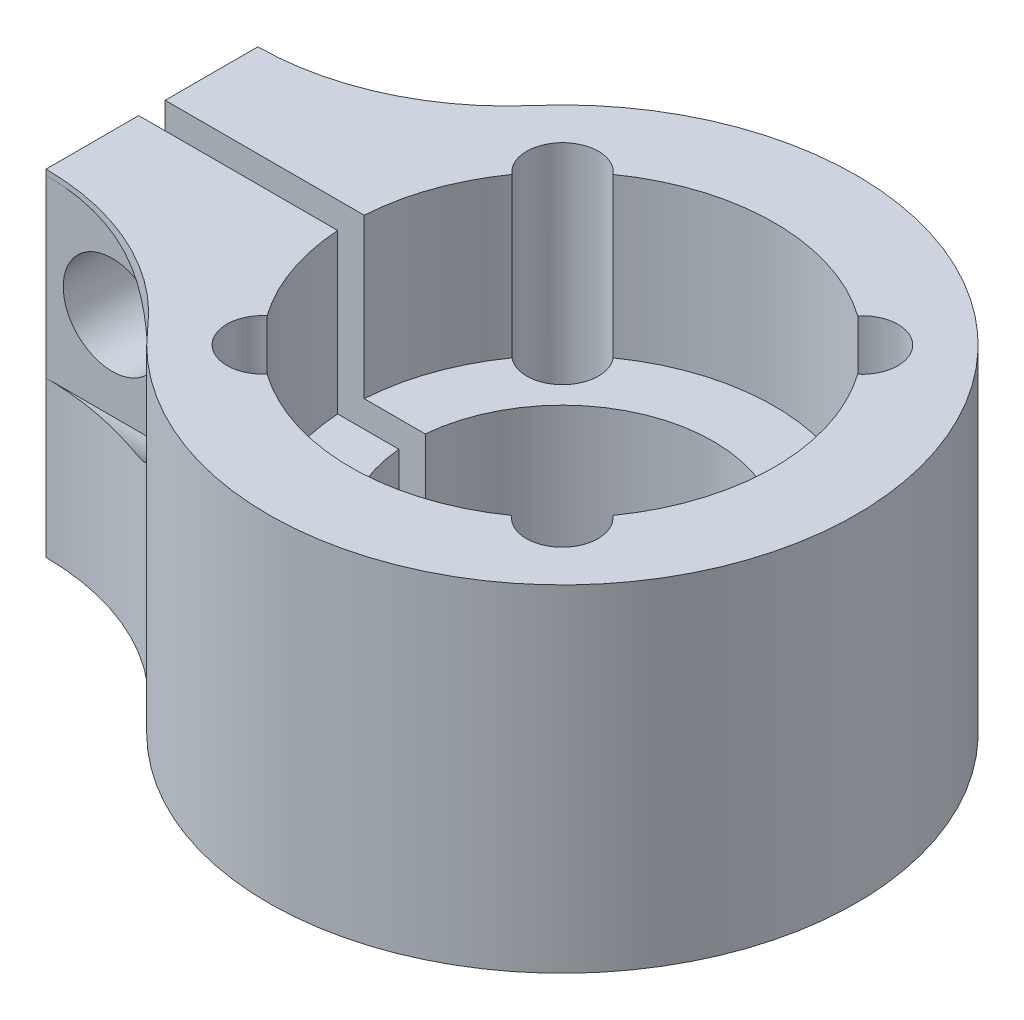
ISO-10303-21;
HEADER;
FILE_DESCRIPTION(('STEP AP214'),'2;1');
FILE_NAME('part.step','',(''),(''),'','','');
FILE_SCHEMA(('AUTOMOTIVE_DESIGN { 1 0 10303 214 1 1 1 1 }'));
ENDSEC;
DATA;
#1=APPLICATION_CONTEXT('core data for automotive mechanical design processes');
#2=APPLICATION_PROTOCOL_DEFINITION('international standard','automotive_design',2000,#1);
#3=PRODUCT_CONTEXT('',#1,'mechanical');
#4=PRODUCT('Part','Part','',(#3));
#5=PRODUCT_RELATED_PRODUCT_CATEGORY('part','',(#4));
#6=PRODUCT_DEFINITION_FORMATION('','',#4);
#7=PRODUCT_DEFINITION_CONTEXT('part definition',#1,'design');
#8=PRODUCT_DEFINITION('design','',#6,#7);
#9=PRODUCT_DEFINITION_SHAPE('','',#8);
#10=(LENGTH_UNIT() NAMED_UNIT(*) SI_UNIT(.MILLI.,.METRE.));
#11=(NAMED_UNIT(*) PLANE_ANGLE_UNIT() SI_UNIT($,.RADIAN.));
#12=(NAMED_UNIT(*) SI_UNIT($,.STERADIAN.) SOLID_ANGLE_UNIT());
#13=UNCERTAINTY_MEASURE_WITH_UNIT(LENGTH_MEASURE(1.E-05),#10,'distance_accuracy_value','');
#14=(GEOMETRIC_REPRESENTATION_CONTEXT(3) GLOBAL_UNCERTAINTY_ASSIGNED_CONTEXT((#13)) GLOBAL_UNIT_ASSIGNED_CONTEXT((#10,
#11,#12)) REPRESENTATION_CONTEXT('',''));
#15=CARTESIAN_POINT('',(0.,0.,0.));
#16=DIRECTION('',(0.,0.,1.));
#17=DIRECTION('',(1.,0.,0.));
#18=AXIS2_PLACEMENT_3D('',#15,#16,#17);
#19=CARTESIAN_POINT('',(0.,9.38839506172839,0.));
#20=DIRECTION('',(0.,1.,0.));
#21=DIRECTION('',(0.,0.,1.));
#22=AXIS2_PLACEMENT_3D('',#19,#20,#21);
#23=CYLINDRICAL_SURFACE('',#22,8.);
#24=CARTESIAN_POINT('',(0.,6.,0.));
#25=DIRECTION('',(0.,1.,0.));
#26=DIRECTION('',(0.,0.,1.));
#27=AXIS2_PLACEMENT_3D('',#24,#25,#26);
#28=CIRCLE('',#27,8.);
#29=CARTESIAN_POINT('',(-6.52782885157314,6.,-4.62465679640871));
#30=VERTEX_POINT('',#29);
#31=CARTESIAN_POINT('',(-7.98435971133566,6.,-0.499999999999998));
#32=VERTEX_POINT('',#31);
#33=EDGE_CURVE('E319',#30,#32,#28,.T.);
#34=ORIENTED_EDGE('',*,*,#33,.T.);
#35=DIRECTION('',(0.,1.,0.));
#36=VECTOR('',#35,1.);
#37=CARTESIAN_POINT('',(-7.98435971133566,9.38839506172839,-0.499999999999998));
#38=LINE('',#37,#36);
#39=CARTESIAN_POINT('',(-7.98435971133566,0.,-0.499999999999998));
#40=VERTEX_POINT('',#39);
#41=EDGE_CURVE('E231',#32,#40,#38,.F.);
#42=ORIENTED_EDGE('',*,*,#41,.T.);
#43=CARTESIAN_POINT('',(0.,0.,0.));
#44=DIRECTION('',(0.,1.,0.));
#45=DIRECTION('',(0.,0.,1.));
#46=AXIS2_PLACEMENT_3D('',#43,#44,#45);
#47=CIRCLE('',#46,8.);
#48=CARTESIAN_POINT('',(-6.52782885157314,0.,-4.62465679640872));
#49=VERTEX_POINT('',#48);
#50=EDGE_CURVE('E325',#49,#40,#47,.T.);
#51=ORIENTED_EDGE('',*,*,#50,.F.);
#52=DIRECTION('',(0.,1.,0.));
#53=VECTOR('',#52,1.);
#54=CARTESIAN_POINT('',(-6.52782885157314,-0.350000000000001,-4.62465679640871));
#55=LINE('',#54,#53);
#56=EDGE_CURVE('E260',#49,#30,#55,.T.);
#57=ORIENTED_EDGE('',*,*,#56,.T.);
#58=EDGE_LOOP('',(#34,#42,#51,#57));
#59=FACE_BOUND('',#58,.T.);
#60=ADVANCED_FACE('F33',(#59),#23,.F.);
#61=CARTESIAN_POINT('',(-15.5,-16.2120443701941,-4.));
#62=DIRECTION('',(-1.,0.,0.));
#63=DIRECTION('',(0.,0.,1.));
#64=AXIS2_PLACEMENT_3D('',#61,#62,#63);
#65=PLANE('',#64);
#66=DIRECTION('',(0.,1.,0.));
#67=VECTOR('',#66,1.);
#68=CARTESIAN_POINT('',(-15.5,-16.7498756211209,-0.499999999999998));
#69=LINE('',#68,#67);
#70=CARTESIAN_POINT('',(-15.5,-6.7,-0.499999999999998));
#71=VERTEX_POINT('',#70);
#72=CARTESIAN_POINT('',(-15.5,6.,-0.499999999999998));
#73=VERTEX_POINT('',#72);
#74=EDGE_CURVE('E209',#71,#73,#69,.T.);
#75=ORIENTED_EDGE('',*,*,#74,.T.);
#76=DIRECTION('',(0.,0.,1.));
#77=VECTOR('',#76,1.);
#78=CARTESIAN_POINT('',(-15.5,6.,-4.));
#79=LINE('',#78,#77);
#80=CARTESIAN_POINT('',(-15.5,6.,-4.));
#81=VERTEX_POINT('',#80);
#82=EDGE_CURVE('E240',#81,#73,#79,.T.);
#83=ORIENTED_EDGE('',*,*,#82,.F.);
#84=DIRECTION('',(0.,1.,0.));
#85=VECTOR('',#84,1.);
#86=CARTESIAN_POINT('',(-15.5,-16.2120443701941,-4.));
#87=LINE('',#86,#85);
#88=CARTESIAN_POINT('',(-15.5,-6.7,-4.));
#89=VERTEX_POINT('',#88);
#90=EDGE_CURVE('E244',#89,#81,#87,.T.);
#91=ORIENTED_EDGE('',*,*,#90,.F.);
#92=DIRECTION('',(0.,0.,-1.));
#93=VECTOR('',#92,1.);
#94=CARTESIAN_POINT('',(-15.5,-6.7,-4.));
#95=LINE('',#94,#93);
#96=EDGE_CURVE('E239',#71,#89,#95,.T.);
#97=ORIENTED_EDGE('',*,*,#96,.F.);
#98=EDGE_LOOP('',(#75,#83,#91,#97));
#99=FACE_BOUND('',#98,.T.);
#100=ADVANCED_FACE('F367',(#99),#65,.T.);
#101=CARTESIAN_POINT('',(-7.98435971133566,0.,0.5));
#102=VERTEX_POINT('',#101);
#103=CARTESIAN_POINT('',(-6.53296974265389,0.,4.61739172494264));
#104=VERTEX_POINT('',#103);
#105=EDGE_CURVE('E326',#102,#104,#47,.T.);
#106=ORIENTED_EDGE('',*,*,#105,.F.);
#107=DIRECTION('',(0.,1.,0.));
#108=VECTOR('',#107,1.);
#109=CARTESIAN_POINT('',(-7.98435971133566,9.38839506172839,0.5));
#110=LINE('',#109,#108);
#111=CARTESIAN_POINT('',(-7.98435971133566,6.,0.5));
#112=VERTEX_POINT('',#111);
#113=EDGE_CURVE('E222',#102,#112,#110,.T.);
#114=ORIENTED_EDGE('',*,*,#113,.T.);
#115=CARTESIAN_POINT('',(-6.53296974265388,6.,4.61739172494265));
#116=VERTEX_POINT('',#115);
#117=EDGE_CURVE('E320',#112,#116,#28,.T.);
#118=ORIENTED_EDGE('',*,*,#117,.T.);
#119=DIRECTION('',(0.,1.,0.));
#120=VECTOR('',#119,1.);
#121=CARTESIAN_POINT('',(-6.53296974265388,-0.350000000000001,4.61739172494265));
#122=LINE('',#121,#120);
#123=EDGE_CURVE('E268',#116,#104,#122,.F.);
#124=ORIENTED_EDGE('',*,*,#123,.T.);
#125=EDGE_LOOP('',(#106,#114,#118,#124));
#126=FACE_BOUND('',#125,.T.);
#127=ADVANCED_FACE('F417',(#126),#23,.F.);
#128=CARTESIAN_POINT('',(-4.6246567964087,0.,6.52782885157315));
#129=VERTEX_POINT('',#128);
#130=CARTESIAN_POINT('',(4.61739172494267,0.,6.53296974265387));
#131=VERTEX_POINT('',#130);
#132=EDGE_CURVE('E434',#129,#131,#47,.T.);
#133=ORIENTED_EDGE('',*,*,#132,.F.);
#134=DIRECTION('',(0.,1.,0.));
#135=VECTOR('',#134,1.);
#136=CARTESIAN_POINT('',(-4.62465679640869,-0.350000000000001,6.52782885157316));
#137=LINE('',#136,#135);
#138=CARTESIAN_POINT('',(-4.62465679640869,6.,6.52782885157316));
#139=VERTEX_POINT('',#138);
#140=EDGE_CURVE('E274',#129,#139,#137,.T.);
#141=ORIENTED_EDGE('',*,*,#140,.T.);
#142=CARTESIAN_POINT('',(4.61739172494268,6.,6.53296974265386));
#143=VERTEX_POINT('',#142);
#144=EDGE_CURVE('E447',#139,#143,#28,.T.);
#145=ORIENTED_EDGE('',*,*,#144,.T.);
#146=DIRECTION('',(0.,1.,0.));
#147=VECTOR('',#146,1.);
#148=CARTESIAN_POINT('',(4.61739172494267,-0.350000000000001,6.53296974265387));
#149=LINE('',#148,#147);
#150=EDGE_CURVE('E282',#143,#131,#149,.F.);
#151=ORIENTED_EDGE('',*,*,#150,.T.);
#152=EDGE_LOOP('',(#133,#141,#145,#151));
#153=FACE_BOUND('',#152,.T.);
#154=ADVANCED_FACE('F424',(#153),#23,.F.);
#155=CARTESIAN_POINT('',(6.52782885157317,0.,4.62465679640867));
#156=VERTEX_POINT('',#155);
#157=CARTESIAN_POINT('',(6.53296974265385,0.,-4.61739172494269));
#158=VERTEX_POINT('',#157);
#159=EDGE_CURVE('E318',#156,#158,#47,.T.);
#160=ORIENTED_EDGE('',*,*,#159,.F.);
#161=DIRECTION('',(0.,1.,0.));
#162=VECTOR('',#161,1.);
#163=CARTESIAN_POINT('',(6.52782885157317,-0.350000000000001,4.62465679640867));
#164=LINE('',#163,#162);
#165=CARTESIAN_POINT('',(6.52782885157317,6.,4.62465679640867));
#166=VERTEX_POINT('',#165);
#167=EDGE_CURVE('E288',#156,#166,#164,.T.);
#168=ORIENTED_EDGE('',*,*,#167,.T.);
#169=CARTESIAN_POINT('',(6.53296974265385,6.,-4.6173917249427));
#170=VERTEX_POINT('',#169);
#171=EDGE_CURVE('E314',#166,#170,#28,.T.);
#172=ORIENTED_EDGE('',*,*,#171,.T.);
#173=DIRECTION('',(0.,1.,0.));
#174=VECTOR('',#173,1.);
#175=CARTESIAN_POINT('',(6.53296974265385,-0.350000000000001,-4.61739172494269));
#176=LINE('',#175,#174);
#177=EDGE_CURVE('E296',#170,#158,#176,.F.);
#178=ORIENTED_EDGE('',*,*,#177,.T.);
#179=EDGE_LOOP('',(#160,#168,#172,#178));
#180=FACE_BOUND('',#179,.T.);
#181=ADVANCED_FACE('F400',(#180),#23,.F.);
#182=CARTESIAN_POINT('',(0.,9.38839506172839,0.));
#183=DIRECTION('',(0.,1.,0.));
#184=DIRECTION('',(0.,0.,1.));
#185=AXIS2_PLACEMENT_3D('',#182,#183,#184);
#186=CYLINDRICAL_SURFACE('',#185,5.7);
#187=CARTESIAN_POINT('',(0.,0.,0.));
#188=DIRECTION('',(0.,1.,0.));
#189=DIRECTION('',(0.,0.,1.));
#190=AXIS2_PLACEMENT_3D('',#187,#188,#189);
#191=CIRCLE('',#190,5.7);
#192=CARTESIAN_POINT('',(-5.67802782663136,0.,0.499999999999999));
#193=VERTEX_POINT('',#192);
#194=CARTESIAN_POINT('',(-5.67802782663136,0.,-0.499999999999998));
#195=VERTEX_POINT('',#194);
#196=EDGE_CURVE('E324',#193,#195,#191,.T.);
#197=ORIENTED_EDGE('',*,*,#196,.T.);
#198=DIRECTION('',(0.,1.,0.));
#199=VECTOR('',#198,1.);
#200=CARTESIAN_POINT('',(-5.67802782663136,9.38839506172839,-0.499999999999998));
#201=LINE('',#200,#199);
#202=CARTESIAN_POINT('',(-5.67802782663136,-6.7,-0.499999999999998));
#203=VERTEX_POINT('',#202);
#204=EDGE_CURVE('E228',#195,#203,#201,.F.);
#205=ORIENTED_EDGE('',*,*,#204,.T.);
#206=CARTESIAN_POINT('',(0.,-6.7,0.));
#207=DIRECTION('',(0.,1.,0.));
#208=DIRECTION('',(0.,0.,1.));
#209=AXIS2_PLACEMENT_3D('',#206,#207,#208);
#210=CIRCLE('',#209,5.7);
#211=CARTESIAN_POINT('',(-5.67802782663136,-6.7,0.499999999999999));
#212=VERTEX_POINT('',#211);
#213=EDGE_CURVE('E305',#212,#203,#210,.T.);
#214=ORIENTED_EDGE('',*,*,#213,.F.);
#215=DIRECTION('',(0.,1.,0.));
#216=VECTOR('',#215,1.);
#217=CARTESIAN_POINT('',(-5.67802782663136,9.38839506172839,0.499999999999999));
#218=LINE('',#217,#216);
#219=EDGE_CURVE('E219',#212,#193,#218,.T.);
#220=ORIENTED_EDGE('',*,*,#219,.T.);
#221=EDGE_LOOP('',(#197,#205,#214,#220));
#222=FACE_BOUND('',#221,.T.);
#223=ADVANCED_FACE('F403',(#222),#186,.F.);
#224=CARTESIAN_POINT('',(5.7,0.,0.));
#225=DIRECTION('',(0.,-1.,0.));
#226=DIRECTION('',(0.,0.,-1.));
#227=AXIS2_PLACEMENT_3D('',#224,#225,#226);
#228=PLANE('',#227);
#229=ORIENTED_EDGE('',*,*,#50,.T.);
#230=DIRECTION('',(1.,0.,0.));
#231=VECTOR('',#230,1.);
#232=CARTESIAN_POINT('',(5.7,0.,-0.499999999999997));
#233=LINE('',#232,#231);
#234=EDGE_CURVE('E225',#40,#195,#233,.T.);
#235=ORIENTED_EDGE('',*,*,#234,.T.);
#236=ORIENTED_EDGE('',*,*,#196,.F.);
#237=DIRECTION('',(-1.,0.,0.));
#238=VECTOR('',#237,1.);
#239=CARTESIAN_POINT('',(5.7,0.,0.499999999999996));
#240=LINE('',#239,#238);
#241=EDGE_CURVE('E216',#193,#102,#240,.T.);
#242=ORIENTED_EDGE('',*,*,#241,.T.);
#243=ORIENTED_EDGE('',*,*,#105,.T.);
#244=CARTESIAN_POINT('',(-5.66000000000004,0.,5.65370674867379));
#245=DIRECTION('',(0.,-1.,0.));
#246=DIRECTION('',(0.,0.,-1.));
#247=AXIS2_PLACEMENT_3D('',#244,#245,#246);
#248=CIRCLE('',#247,1.355);
#249=EDGE_CURVE('E271',#104,#129,#248,.T.);
#250=ORIENTED_EDGE('',*,*,#249,.T.);
#251=ORIENTED_EDGE('',*,*,#132,.T.);
#252=CARTESIAN_POINT('',(5.65370674867381,0.,5.66000000000002));
#253=DIRECTION('',(0.,-1.,0.));
#254=DIRECTION('',(0.,0.,-1.));
#255=AXIS2_PLACEMENT_3D('',#252,#253,#254);
#256=CIRCLE('',#255,1.355);
#257=EDGE_CURVE('E285',#131,#156,#256,.T.);
#258=ORIENTED_EDGE('',*,*,#257,.T.);
#259=ORIENTED_EDGE('',*,*,#159,.T.);
#260=CARTESIAN_POINT('',(5.66,0.,-5.65370674867383));
#261=DIRECTION('',(0.,-1.,0.));
#262=DIRECTION('',(0.,0.,-1.));
#263=AXIS2_PLACEMENT_3D('',#260,#261,#262);
#264=CIRCLE('',#263,1.355);
#265=CARTESIAN_POINT('',(4.62465679640865,0.,-6.52782885157318));
#266=VERTEX_POINT('',#265);
#267=EDGE_CURVE('E299',#158,#266,#264,.T.);
#268=ORIENTED_EDGE('',*,*,#267,.T.);
#269=CARTESIAN_POINT('',(-4.61739172494262,0.,-6.5329697426539));
#270=VERTEX_POINT('',#269);
#271=EDGE_CURVE('E321',#266,#270,#47,.T.);
#272=ORIENTED_EDGE('',*,*,#271,.T.);
#273=CARTESIAN_POINT('',(-5.65370674867377,0.,-5.66000000000006));
#274=DIRECTION('',(0.,-1.,0.));
#275=DIRECTION('',(0.,0.,-1.));
#276=AXIS2_PLACEMENT_3D('',#273,#274,#275);
#277=CIRCLE('',#276,1.355);
#278=EDGE_CURVE('E257',#270,#49,#277,.T.);
#279=ORIENTED_EDGE('',*,*,#278,.T.);
#280=EDGE_LOOP('',(#229,#235,#236,#242,#243,#250,#251,#258,#259,#268,#272,#279));
#281=FACE_BOUND('',#280,.T.);
#282=ADVANCED_FACE('F398',(#281),#228,.F.);
#283=CARTESIAN_POINT('',(4.62465679640865,6.,-6.52782885157319));
#284=VERTEX_POINT('',#283);
#285=CARTESIAN_POINT('',(-4.61739172494263,6.,-6.5329697426539));
#286=VERTEX_POINT('',#285);
#287=EDGE_CURVE('E315',#284,#286,#28,.T.);
#288=ORIENTED_EDGE('',*,*,#287,.T.);
#289=DIRECTION('',(0.,1.,0.));
#290=VECTOR('',#289,1.);
#291=CARTESIAN_POINT('',(-4.61739172494263,-0.350000000000001,-6.5329697426539));
#292=LINE('',#291,#290);
#293=EDGE_CURVE('E254',#286,#270,#292,.F.);
#294=ORIENTED_EDGE('',*,*,#293,.T.);
#295=ORIENTED_EDGE('',*,*,#271,.F.);
#296=DIRECTION('',(0.,1.,0.));
#297=VECTOR('',#296,1.);
#298=CARTESIAN_POINT('',(4.62465679640865,-0.350000000000001,-6.52782885157319));
#299=LINE('',#298,#297);
#300=EDGE_CURVE('E302',#266,#284,#299,.T.);
#301=ORIENTED_EDGE('',*,*,#300,.T.);
#302=EDGE_LOOP('',(#288,#294,#295,#301));
#303=FACE_BOUND('',#302,.T.);
#304=ADVANCED_FACE('F394',(#303),#23,.F.);
#305=CARTESIAN_POINT('',(8.,6.,0.));
#306=DIRECTION('',(0.,-1.,0.));
#307=DIRECTION('',(0.,0.,-1.));
#308=AXIS2_PLACEMENT_3D('',#305,#306,#307);
#309=PLANE('',#308);
#310=ORIENTED_EDGE('',*,*,#82,.T.);
#311=DIRECTION('',(-1.,0.,0.));
#312=VECTOR('',#311,1.);
#313=CARTESIAN_POINT('',(-15.5,6.,-0.499999999999998));
#314=LINE('',#313,#312);
#315=EDGE_CURVE('E61',#32,#73,#314,.T.);
#316=ORIENTED_EDGE('',*,*,#315,.F.);
#317=ORIENTED_EDGE('',*,*,#33,.F.);
#318=CARTESIAN_POINT('',(-5.65370674867377,6.,-5.66000000000006));
#319=DIRECTION('',(0.,1.,0.));
#320=DIRECTION('',(1.,0.,0.));
#321=AXIS2_PLACEMENT_3D('',#318,#319,#320);
#322=CIRCLE('',#321,1.355);
#323=EDGE_CURVE('E238',#286,#30,#322,.T.);
#324=ORIENTED_EDGE('',*,*,#323,.F.);
#325=ORIENTED_EDGE('',*,*,#287,.F.);
#326=CARTESIAN_POINT('',(5.66,6.,-5.65370674867383));
#327=DIRECTION('',(0.,1.,0.));
#328=DIRECTION('',(0.,0.,1.));
#329=AXIS2_PLACEMENT_3D('',#326,#327,#328);
#330=CIRCLE('',#329,1.355);
#331=EDGE_CURVE('E291',#170,#284,#330,.T.);
#332=ORIENTED_EDGE('',*,*,#331,.F.);
#333=ORIENTED_EDGE('',*,*,#171,.F.);
#334=CARTESIAN_POINT('',(5.65370674867381,6.,5.66000000000002));
#335=DIRECTION('',(0.,1.,0.));
#336=DIRECTION('',(-1.,0.,0.));
#337=AXIS2_PLACEMENT_3D('',#334,#335,#336);
#338=CIRCLE('',#337,1.355);
#339=EDGE_CURVE('E277',#143,#166,#338,.T.);
#340=ORIENTED_EDGE('',*,*,#339,.F.);
#341=ORIENTED_EDGE('',*,*,#144,.F.);
#342=CARTESIAN_POINT('',(-5.66000000000004,6.,5.65370674867379));
#343=DIRECTION('',(0.,1.,0.));
#344=DIRECTION('',(0.,0.,-1.));
#345=AXIS2_PLACEMENT_3D('',#342,#343,#344);
#346=CIRCLE('',#345,1.355);
#347=EDGE_CURVE('E263',#116,#139,#346,.T.);
#348=ORIENTED_EDGE('',*,*,#347,.F.);
#349=ORIENTED_EDGE('',*,*,#117,.F.);
#350=DIRECTION('',(1.,0.,0.));
#351=VECTOR('',#350,1.);
#352=CARTESIAN_POINT('',(-15.5,6.,0.500000000000002));
#353=LINE('',#352,#351);
#354=CARTESIAN_POINT('',(-15.5,6.,0.500000000000002));
#355=VERTEX_POINT('',#354);
#356=EDGE_CURVE('E204',#355,#112,#353,.T.);
#357=ORIENTED_EDGE('',*,*,#356,.F.);
#358=CARTESIAN_POINT('',(-15.5,6.,4.));
#359=VERTEX_POINT('',#358);
#360=EDGE_CURVE('E234',#355,#359,#79,.T.);
#361=ORIENTED_EDGE('',*,*,#360,.T.);
#362=CARTESIAN_POINT('',(-15.5361985405909,6.,13.4479306552101));
#363=DIRECTION('',(0.,-1.,0.));
#364=DIRECTION('',(0.,0.,-1.));
#365=AXIS2_PLACEMENT_3D('',#362,#363,#364);
#366=CIRCLE('',#365,9.448);
#367=CARTESIAN_POINT('',(-8.39263207127503,6.,7.26455276780379));
#368=VERTEX_POINT('',#367);
#369=EDGE_CURVE('E338',#359,#368,#366,.T.);
#370=ORIENTED_EDGE('',*,*,#369,.T.);
#371=CARTESIAN_POINT('',(0.,6.,0.));
#372=DIRECTION('',(0.,1.,0.));
#373=DIRECTION('',(0.,0.,1.));
#374=AXIS2_PLACEMENT_3D('',#371,#372,#373);
#375=CIRCLE('',#374,11.1);
#376=CARTESIAN_POINT('',(-8.39263207127503,6.,-7.26455276780379));
#377=VERTEX_POINT('',#376);
#378=EDGE_CURVE('E311',#368,#377,#375,.T.);
#379=ORIENTED_EDGE('',*,*,#378,.T.);
#380=CARTESIAN_POINT('',(-15.5361985405909,6.,-13.4479306552101));
#381=DIRECTION('',(0.,-1.,0.));
#382=DIRECTION('',(0.,0.,-1.));
#383=AXIS2_PLACEMENT_3D('',#380,#381,#382);
#384=CIRCLE('',#383,9.448);
#385=EDGE_CURVE('E334',#377,#81,#384,.T.);
#386=ORIENTED_EDGE('',*,*,#385,.T.);
#387=EDGE_LOOP('',(#310,#316,#317,#324,#325,#332,#333,#340,#341,#348,#349,#357,#361,#370,#379,#386));
#388=FACE_BOUND('',#387,.T.);
#389=ADVANCED_FACE('F390',(#388),#309,.F.);
#390=CARTESIAN_POINT('',(0.,9.38839506172839,0.));
#391=DIRECTION('',(0.,1.,0.));
#392=DIRECTION('',(0.,0.,1.));
#393=AXIS2_PLACEMENT_3D('',#390,#391,#392);
#394=CYLINDRICAL_SURFACE('',#393,11.1);
#395=CARTESIAN_POINT('',(0.,-6.7,0.));
#396=DIRECTION('',(0.,1.,0.));
#397=DIRECTION('',(0.,0.,1.));
#398=AXIS2_PLACEMENT_3D('',#395,#396,#397);
#399=CIRCLE('',#398,11.1);
#400=CARTESIAN_POINT('',(-8.39263207127504,-6.7,7.26455276780379));
#401=VERTEX_POINT('',#400);
#402=CARTESIAN_POINT('',(-8.39263207127504,-6.7,-7.26455276780379));
#403=VERTEX_POINT('',#402);
#404=EDGE_CURVE('E308',#401,#403,#399,.T.);
#405=ORIENTED_EDGE('',*,*,#404,.T.);
#406=DIRECTION('',(0.,1.,0.));
#407=VECTOR('',#406,1.);
#408=CARTESIAN_POINT('',(-8.39263207127503,9.38839506172839,-7.26455276780379));
#409=LINE('',#408,#407);
#410=EDGE_CURVE('E331',#403,#377,#409,.T.);
#411=ORIENTED_EDGE('',*,*,#410,.T.);
#412=ORIENTED_EDGE('',*,*,#378,.F.);
#413=DIRECTION('',(0.,1.,0.));
#414=VECTOR('',#413,1.);
#415=CARTESIAN_POINT('',(-8.39263207127503,9.38839506172839,7.26455276780379));
#416=LINE('',#415,#414);
#417=EDGE_CURVE('E329',#368,#401,#416,.F.);
#418=ORIENTED_EDGE('',*,*,#417,.T.);
#419=EDGE_LOOP('',(#405,#411,#412,#418));
#420=FACE_BOUND('',#419,.T.);
#421=ADVANCED_FACE('F386',(#420),#394,.T.);
#422=CARTESIAN_POINT('',(11.1,-6.7,0.));
#423=DIRECTION('',(0.,1.,0.));
#424=DIRECTION('',(0.,0.,1.));
#425=AXIS2_PLACEMENT_3D('',#422,#423,#424);
#426=PLANE('',#425);
#427=CARTESIAN_POINT('',(-5.65370674867377,-6.7,-5.66000000000006));
#428=DIRECTION('',(0.,1.,0.));
#429=DIRECTION('',(0.,0.,1.));
#430=AXIS2_PLACEMENT_3D('',#427,#428,#429);
#431=CIRCLE('',#430,1.355);
#432=CARTESIAN_POINT('',(-5.65370674867377,-6.7,-4.30500000000006));
#433=VERTEX_POINT('',#432);
#434=EDGE_CURVE('E251',#433,#433,#431,.F.);
#435=ORIENTED_EDGE('',*,*,#434,.F.);
#436=EDGE_LOOP('',(#435));
#437=FACE_BOUND('',#436,.T.);
#438=CARTESIAN_POINT('',(-5.66000000000004,-6.7,5.65370674867379));
#439=DIRECTION('',(0.,1.,0.));
#440=DIRECTION('',(0.,0.,1.));
#441=AXIS2_PLACEMENT_3D('',#438,#439,#440);
#442=CIRCLE('',#441,1.355);
#443=CARTESIAN_POINT('',(-5.66000000000004,-6.7,7.00870674867379));
#444=VERTEX_POINT('',#443);
#445=EDGE_CURVE('E265',#444,#444,#442,.F.);
#446=ORIENTED_EDGE('',*,*,#445,.F.);
#447=EDGE_LOOP('',(#446));
#448=FACE_BOUND('',#447,.T.);
#449=CARTESIAN_POINT('',(5.65370674867381,-6.7,5.66000000000002));
#450=DIRECTION('',(0.,1.,0.));
#451=DIRECTION('',(0.,0.,1.));
#452=AXIS2_PLACEMENT_3D('',#449,#450,#451);
#453=CIRCLE('',#452,1.355);
#454=CARTESIAN_POINT('',(5.65370674867381,-6.7,7.01500000000002));
#455=VERTEX_POINT('',#454);
#456=EDGE_CURVE('E279',#455,#455,#453,.F.);
#457=ORIENTED_EDGE('',*,*,#456,.F.);
#458=EDGE_LOOP('',(#457));
#459=FACE_BOUND('',#458,.T.);
#460=CARTESIAN_POINT('',(5.66,-6.7,-5.65370674867383));
#461=DIRECTION('',(0.,1.,0.));
#462=DIRECTION('',(0.,0.,1.));
#463=AXIS2_PLACEMENT_3D('',#460,#461,#462);
#464=CIRCLE('',#463,1.355);
#465=CARTESIAN_POINT('',(5.66,-6.7,-4.29870674867383));
#466=VERTEX_POINT('',#465);
#467=EDGE_CURVE('E293',#466,#466,#464,.F.);
#468=ORIENTED_EDGE('',*,*,#467,.F.);
#469=EDGE_LOOP('',(#468));
#470=FACE_BOUND('',#469,.T.);
#471=ORIENTED_EDGE('',*,*,#213,.T.);
#472=DIRECTION('',(1.,0.,0.));
#473=VECTOR('',#472,1.);
#474=CARTESIAN_POINT('',(-15.5,-6.7,-0.499999999999998));
#475=LINE('',#474,#473);
#476=EDGE_CURVE('E206',#71,#203,#475,.T.);
#477=ORIENTED_EDGE('',*,*,#476,.F.);
#478=ORIENTED_EDGE('',*,*,#96,.T.);
#479=CARTESIAN_POINT('',(-15.5361985405909,-6.7,-13.4479306552101));
#480=DIRECTION('',(0.,1.,0.));
#481=DIRECTION('',(0.,0.,1.));
#482=AXIS2_PLACEMENT_3D('',#479,#480,#481);
#483=CIRCLE('',#482,9.448);
#484=EDGE_CURVE('E336',#89,#403,#483,.T.);
#485=ORIENTED_EDGE('',*,*,#484,.T.);
#486=ORIENTED_EDGE('',*,*,#404,.F.);
#487=CARTESIAN_POINT('',(-15.5361985405909,-6.7,13.4479306552101));
#488=DIRECTION('',(0.,1.,0.));
#489=DIRECTION('',(0.,0.,1.));
#490=AXIS2_PLACEMENT_3D('',#487,#488,#489);
#491=CIRCLE('',#490,9.448);
#492=CARTESIAN_POINT('',(-15.5,-6.7,4.));
#493=VERTEX_POINT('',#492);
#494=EDGE_CURVE('E340',#401,#493,#491,.T.);
#495=ORIENTED_EDGE('',*,*,#494,.T.);
#496=CARTESIAN_POINT('',(-15.5,-6.7,0.500000000000002));
#497=VERTEX_POINT('',#496);
#498=EDGE_CURVE('E235',#493,#497,#95,.T.);
#499=ORIENTED_EDGE('',*,*,#498,.T.);
#500=DIRECTION('',(-1.,0.,0.));
#501=VECTOR('',#500,1.);
#502=CARTESIAN_POINT('',(-15.5,-6.7,0.500000000000002));
#503=LINE('',#502,#501);
#504=EDGE_CURVE('E208',#212,#497,#503,.T.);
#505=ORIENTED_EDGE('',*,*,#504,.F.);
#506=EDGE_LOOP('',(#471,#477,#478,#485,#486,#495,#499,#505));
#507=FACE_BOUND('',#506,.T.);
#508=ADVANCED_FACE('F382',(#437,#448,#459,#470,#507),#426,.F.);
#509=CARTESIAN_POINT('',(5.66,-10.5325187540311,-5.65370674867383));
#510=DIRECTION('',(0.,1.,0.));
#511=DIRECTION('',(0.,0.,1.));
#512=AXIS2_PLACEMENT_3D('',#509,#510,#511);
#513=CYLINDRICAL_SURFACE('',#512,1.355);
#514=ORIENTED_EDGE('',*,*,#467,.T.);
#515=EDGE_LOOP('',(#514));
#516=FACE_BOUND('',#515,.T.);
#517=ORIENTED_EDGE('',*,*,#267,.F.);
#518=ORIENTED_EDGE('',*,*,#177,.F.);
#519=ORIENTED_EDGE('',*,*,#331,.T.);
#520=ORIENTED_EDGE('',*,*,#300,.F.);
#521=EDGE_LOOP('',(#517,#518,#519,#520));
#522=FACE_BOUND('',#521,.T.);
#523=ADVANCED_FACE('F378',(#516,#522),#513,.F.);
#524=CARTESIAN_POINT('',(5.65370674867381,-10.5325187540311,5.66000000000002));
#525=DIRECTION('',(0.,1.,0.));
#526=DIRECTION('',(0.,0.,1.));
#527=AXIS2_PLACEMENT_3D('',#524,#525,#526);
#528=CYLINDRICAL_SURFACE('',#527,1.355);
#529=ORIENTED_EDGE('',*,*,#456,.T.);
#530=EDGE_LOOP('',(#529));
#531=FACE_BOUND('',#530,.T.);
#532=ORIENTED_EDGE('',*,*,#257,.F.);
#533=ORIENTED_EDGE('',*,*,#150,.F.);
#534=ORIENTED_EDGE('',*,*,#339,.T.);
#535=ORIENTED_EDGE('',*,*,#167,.F.);
#536=EDGE_LOOP('',(#532,#533,#534,#535));
#537=FACE_BOUND('',#536,.T.);
#538=ADVANCED_FACE('F374',(#531,#537),#528,.F.);
#539=CARTESIAN_POINT('',(-5.66000000000004,-10.5325187540311,5.65370674867379));
#540=DIRECTION('',(0.,1.,0.));
#541=DIRECTION('',(0.,0.,1.));
#542=AXIS2_PLACEMENT_3D('',#539,#540,#541);
#543=CYLINDRICAL_SURFACE('',#542,1.355);
#544=ORIENTED_EDGE('',*,*,#445,.T.);
#545=EDGE_LOOP('',(#544));
#546=FACE_BOUND('',#545,.T.);
#547=ORIENTED_EDGE('',*,*,#249,.F.);
#548=ORIENTED_EDGE('',*,*,#123,.F.);
#549=ORIENTED_EDGE('',*,*,#347,.T.);
#550=ORIENTED_EDGE('',*,*,#140,.F.);
#551=EDGE_LOOP('',(#547,#548,#549,#550));
#552=FACE_BOUND('',#551,.T.);
#553=ADVANCED_FACE('F370',(#546,#552),#543,.F.);
#554=CARTESIAN_POINT('',(-5.65370674867377,-10.5325187540311,-5.66000000000006));
#555=DIRECTION('',(0.,1.,0.));
#556=DIRECTION('',(0.,0.,1.));
#557=AXIS2_PLACEMENT_3D('',#554,#555,#556);
#558=CYLINDRICAL_SURFACE('',#557,1.355);
#559=ORIENTED_EDGE('',*,*,#434,.T.);
#560=EDGE_LOOP('',(#559));
#561=FACE_BOUND('',#560,.T.);
#562=ORIENTED_EDGE('',*,*,#278,.F.);
#563=ORIENTED_EDGE('',*,*,#293,.F.);
#564=ORIENTED_EDGE('',*,*,#323,.T.);
#565=ORIENTED_EDGE('',*,*,#56,.F.);
#566=EDGE_LOOP('',(#562,#563,#564,#565));
#567=FACE_BOUND('',#566,.T.);
#568=ADVANCED_FACE('F365',(#561,#567),#558,.F.);
#569=DIRECTION('',(0.,1.,0.));
#570=VECTOR('',#569,1.);
#571=CARTESIAN_POINT('',(-15.5,-16.7498756211209,0.500000000000002));
#572=LINE('',#571,#570);
#573=EDGE_CURVE('E212',#497,#355,#572,.T.);
#574=ORIENTED_EDGE('',*,*,#573,.F.);
#575=ORIENTED_EDGE('',*,*,#498,.F.);
#576=DIRECTION('',(0.,1.,0.));
#577=VECTOR('',#576,1.);
#578=CARTESIAN_POINT('',(-15.5,-16.2120443701941,4.));
#579=LINE('',#578,#577);
#580=CARTESIAN_POINT('',(-15.5,-0.832867879830922,4.));
#581=VERTEX_POINT('',#580);
#582=EDGE_CURVE('E247',#493,#581,#579,.T.);
#583=ORIENTED_EDGE('',*,*,#582,.T.);
#584=DIRECTION('',(0.,-1.,0.));
#585=VECTOR('',#584,1.);
#586=CARTESIAN_POINT('',(-15.5,5.8,4.));
#587=LINE('',#586,#585);
#588=CARTESIAN_POINT('',(-15.5,5.8,4.));
#589=VERTEX_POINT('',#588);
#590=EDGE_CURVE('E191',#589,#581,#587,.T.);
#591=ORIENTED_EDGE('',*,*,#590,.F.);
#592=EDGE_CURVE('E243',#589,#359,#579,.T.);
#593=ORIENTED_EDGE('',*,*,#592,.T.);
#594=ORIENTED_EDGE('',*,*,#360,.F.);
#595=EDGE_LOOP('',(#574,#575,#583,#591,#593,#594));
#596=FACE_BOUND('',#595,.T.);
#597=ADVANCED_FACE('F361',(#596),#65,.T.);
#598=CARTESIAN_POINT('',(-15.5361985405909,-16.2120443701941,-13.4479306552101));
#599=DIRECTION('',(0.,-1.,0.));
#600=DIRECTION('',(0.,0.,-1.));
#601=AXIS2_PLACEMENT_3D('',#598,#599,#600);
#602=CYLINDRICAL_SURFACE('',#601,9.448);
#603=CARTESIAN_POINT('',(-11.6475,2.48356606008454,-4.83731350773423));
#604=CARTESIAN_POINT('',(-11.6475036574394,2.41204317039444,-4.83731106531589));
#605=CARTESIAN_POINT('',(-11.6532007339527,2.34047447073124,-4.83473194142462));
#606=CARTESIAN_POINT('',(-11.6757493441425,2.19943717187979,-4.82460290644078));
#607=CARTESIAN_POINT('',(-11.692612999796,2.1299709408362,-4.81704759345047));
#608=CARTESIAN_POINT('',(-11.7367260135132,1.99530185125196,-4.79753831836491));
#609=CARTESIAN_POINT('',(-11.7639472649884,1.93008800944737,-4.78559626323184));
#610=CARTESIAN_POINT('',(-11.8277728040534,1.80529219807321,-4.75808110856509));
#611=CARTESIAN_POINT('',(-11.8643772999114,1.74571035355027,-4.74250792843654));
#612=CARTESIAN_POINT('',(-11.9476451278473,1.63089085361118,-4.70784452654958));
#613=CARTESIAN_POINT('',(-11.9946824402099,1.57596287086718,-4.688628996273));
#614=CARTESIAN_POINT('',(-12.0964282560559,1.47461853802182,-4.6481760635498));
#615=CARTESIAN_POINT('',(-12.1511393591201,1.42820508465906,-4.62693797672593));
#616=CARTESIAN_POINT('',(-12.2714272998638,1.3414831430158,-4.58167953104868));
#617=CARTESIAN_POINT('',(-12.3375187189255,1.30193274344601,-4.55757134850711));
#618=CARTESIAN_POINT('',(-12.4753919998061,1.23459368270203,-4.50916641423504));
#619=CARTESIAN_POINT('',(-12.5471753849597,1.2068081828549,-4.48486961360503));
#620=CARTESIAN_POINT('',(-12.6973991301464,1.16294732783241,-4.43613960292741));
#621=CARTESIAN_POINT('',(-12.7759877023038,1.14734509587094,-4.41173482681651));
#622=CARTESIAN_POINT('',(-12.9351925869276,1.13025022861975,-4.36462951182525));
#623=CARTESIAN_POINT('',(-13.0158087405939,1.12875649178258,-4.34192884003102));
#624=CARTESIAN_POINT('',(-13.1753315033649,1.14013690128483,-4.29928512904919));
#625=CARTESIAN_POINT('',(-13.2542443015738,1.15277332713366,-4.27930262102324));
#626=CARTESIAN_POINT('',(-13.4092135882839,1.19198417625534,-4.24211798474568));
#627=CARTESIAN_POINT('',(-13.4852707559635,1.21855526253916,-4.22491519211412));
#628=CARTESIAN_POINT('',(-13.6290222135644,1.28374696044891,-4.19414347300846));
#629=CARTESIAN_POINT('',(-13.6969293564247,1.32184289495913,-4.18045668731526));
#630=CARTESIAN_POINT('',(-13.8255280230153,1.40941165055283,-4.1558587203067));
#631=CARTESIAN_POINT('',(-13.886220765369,1.4588825460757,-4.14494706987238));
#632=CARTESIAN_POINT('',(-13.9967096436767,1.5661879726277,-4.12603516493981));
#633=CARTESIAN_POINT('',(-14.0467743408457,1.62373283356047,-4.11795854207445));
#634=CARTESIAN_POINT('',(-14.1366258974876,1.74659360043007,-4.10405706777199));
#635=CARTESIAN_POINT('',(-14.1764134447105,1.81190898593353,-4.09823206564278));
#636=CARTESIAN_POINT('',(-14.2440868384076,1.947661924662,-4.08864051236544));
#637=CARTESIAN_POINT('',(-14.2721001617041,2.01803441311587,-4.08485178280753));
#638=CARTESIAN_POINT('',(-14.3160146280729,2.16253122229421,-4.07902731791296));
#639=CARTESIAN_POINT('',(-14.3319159223515,2.23665549616919,-4.0769915606922));
#640=CARTESIAN_POINT('',(-14.3511137723254,2.38641751190128,-4.07454422206481));
#641=CARTESIAN_POINT('',(-14.3544314516638,2.46205250296828,-4.07412991874698));
#642=CARTESIAN_POINT('',(-14.3484224160945,2.61281062269257,-4.07488949849611));
#643=CARTESIAN_POINT('',(-14.3390957170868,2.6879337519934,-4.07606337956596));
#644=CARTESIAN_POINT('',(-14.3080736296617,2.83554309015448,-4.08007844427778));
#645=CARTESIAN_POINT('',(-14.2863769996202,2.90802903353174,-4.08291979529185));
#646=CARTESIAN_POINT('',(-14.2312648932834,3.04829684880081,-4.09044056210154));
#647=CARTESIAN_POINT('',(-14.1978495788268,3.11607878564092,-4.09511995251338));
#648=CARTESIAN_POINT('',(-14.1203167750148,3.24501522640437,-4.10654361898833));
#649=CARTESIAN_POINT('',(-14.0762002911015,3.30617035217778,-4.11328770107627));
#650=CARTESIAN_POINT('',(-13.9786170193001,3.42015215589021,-4.12907451844419));
#651=CARTESIAN_POINT('',(-13.9251504074921,3.4729789906307,-4.13811721043856));
#652=CARTESIAN_POINT('',(-13.8103716740404,3.56899966299262,-4.1587096835946));
#653=CARTESIAN_POINT('',(-13.7490408016481,3.61216977804988,-4.17026550419544));
#654=CARTESIAN_POINT('',(-13.6205137398201,3.68763149098694,-4.19595001551868));
#655=CARTESIAN_POINT('',(-13.5533173538521,3.71992272417797,-4.21007879246889));
#656=CARTESIAN_POINT('',(-13.414157923844,3.77327699406587,-4.24104251708688));
#657=CARTESIAN_POINT('',(-13.3421444269458,3.79418923565879,-4.25791013531469));
#658=CARTESIAN_POINT('',(-13.1962242884802,3.82382653477065,-4.2939766117989));
#659=CARTESIAN_POINT('',(-13.1223173719953,3.83254981216681,-4.31317581012322));
#660=CARTESIAN_POINT('',(-12.9723463174342,3.8379263207052,-4.35410926509203));
#661=CARTESIAN_POINT('',(-12.8962850613735,3.83420370105132,-4.37590293760151));
#662=CARTESIAN_POINT('',(-12.7462616528607,3.81420650060882,-4.42091030405318));
#663=CARTESIAN_POINT('',(-12.6722999793182,3.79792907957692,-4.44412431822171));
#664=CARTESIAN_POINT('',(-12.5254603871859,3.75250428479446,-4.49213041850237));
#665=CARTESIAN_POINT('',(-12.4527396090567,3.72287573176974,-4.51694865769634));
#666=CARTESIAN_POINT('',(-12.313403551065,3.65145856095821,-4.56627732028945));
#667=CARTESIAN_POINT('',(-12.2467895159578,3.60966747126101,-4.59078768005789));
#668=CARTESIAN_POINT('',(-12.1204064674102,3.5140772148427,-4.63874702842678));
#669=CARTESIAN_POINT('',(-12.0607711959865,3.46008817233183,-4.66217127970286));
#670=CARTESIAN_POINT('',(-11.951531319462,3.34173294318176,-4.70617221654115));
#671=CARTESIAN_POINT('',(-11.9019271938558,3.27736626074941,-4.72674876596669));
#672=CARTESIAN_POINT('',(-11.8163323274824,3.14258906926591,-4.76292170425249));
#673=CARTESIAN_POINT('',(-11.7798856694079,3.07251267464177,-4.77868117594123));
#674=CARTESIAN_POINT('',(-11.7195869480118,2.92631120845761,-4.80505631881863));
#675=CARTESIAN_POINT('',(-11.6957109403139,2.85019795650139,-4.81568176601507));
#676=CARTESIAN_POINT('',(-11.6683589329133,2.72509915726892,-4.82791672095227));
#677=CARTESIAN_POINT('',(-11.6605536664131,2.67720183569602,-4.83142827675549));
#678=CARTESIAN_POINT('',(-11.6501231224923,2.58073204929348,-4.83612742582949));
#679=CARTESIAN_POINT('',(-11.6474975150888,2.53215962767131,-4.83731516714454));
#680=CARTESIAN_POINT('',(-11.6475,2.48356606008454,-4.83731350773423));
#681=B_SPLINE_CURVE_WITH_KNOTS('',3,(#603,#604,#605,#606,#607,#608,#609,#610,#611,#612,#613,
#614,#615,#616,#617,#618,#619,#620,#621,#622,#623,#624,#625,#626,#627,#628,#629,#630,#631,#632,
#633,#634,#635,#636,#637,#638,#639,#640,#641,#642,#643,#644,#645,#646,#647,#648,#649,#650,#651,
#652,#653,#654,#655,#656,#657,#658,#659,#660,#661,#662,#663,#664,#665,#666,#667,#668,#669,#670,
#671,#672,#673,#674,#675,#676,#677,#678,#679,#680),.UNSPECIFIED.,.T.,.F.,(4,2,2,2,2,2,2,2,2,2,2,
2,2,2,2,2,2,2,2,2,2,2,2,2,2,2,2,2,2,2,2,2,2,2,2,2,2,2,4),(0.,0.214381272080663,
0.428995649982066,0.643031751951907,0.857072605026262,1.08060205749109,1.3042074167249,
1.54524598374749,1.78634927881062,2.03640507928313,2.28644135601435,2.53233357479218,
2.778166935645,3.01416379949622,3.25012074302229,3.47911924054214,3.70810240943924,
3.93453825007866,4.16097126385413,4.38702400435224,4.61307646059397,4.83915161070622,
5.06522363877342,5.2912744341736,5.51732097307838,5.74391686093405,5.97052034412484,
6.20005786607116,6.42962890704936,6.66619456982206,6.90281376599252,7.14874292624638,
7.39472210401702,7.64483222914057,7.89495430685195,8.13531024523362,8.37520668576405,
8.52086934870592,8.66652273155061),.UNSPECIFIED.);
#682=CARTESIAN_POINT('',(-11.6475,2.48356606008454,-4.83731350773423));
#683=VERTEX_POINT('',#682);
#684=EDGE_CURVE('E500',#683,#683,#681,.T.);
#685=ORIENTED_EDGE('',*,*,#684,.F.);
#686=EDGE_LOOP('',(#685));
#687=FACE_BOUND('',#686,.T.);
#688=ORIENTED_EDGE('',*,*,#484,.F.);
#689=ORIENTED_EDGE('',*,*,#90,.T.);
#690=ORIENTED_EDGE('',*,*,#385,.F.);
#691=ORIENTED_EDGE('',*,*,#410,.F.);
#692=EDGE_LOOP('',(#688,#689,#690,#691));
#693=FACE_BOUND('',#692,.T.);
#694=ADVANCED_FACE('F364',(#687,#693),#602,.F.);
#695=CARTESIAN_POINT('',(-15.5361985405909,9.38839506172839,13.4479306552101));
#696=DIRECTION('',(0.,-1.,0.));
#697=DIRECTION('',(0.,0.,-1.));
#698=AXIS2_PLACEMENT_3D('',#695,#696,#697);
#699=CYLINDRICAL_SURFACE('',#698,9.448);
#700=ORIENTED_EDGE('',*,*,#592,.F.);
#701=CARTESIAN_POINT('',(-15.5,5.8,4.));
#702=CARTESIAN_POINT('',(-15.3706500494488,5.79990582631239,4.0004939501314));
#703=CARTESIAN_POINT('',(-15.2413110932934,5.79940635546095,4.00364753404048));
#704=CARTESIAN_POINT('',(-14.9828739798109,5.79749108123633,4.01526083399959));
#705=CARTESIAN_POINT('',(-14.8537758310774,5.79607524576617,4.02372073591073));
#706=CARTESIAN_POINT('',(-14.5958805628653,5.79221898871816,4.04594795119955));
#707=CARTESIAN_POINT('',(-14.4670840536409,5.78977723638441,4.05972215605879));
#708=CARTESIAN_POINT('',(-14.210204639393,5.78365982140875,4.0925463341768));
#709=CARTESIAN_POINT('',(-14.0821217249511,5.77998417509166,4.11159623763579));
#710=CARTESIAN_POINT('',(-13.6970808623096,5.76663667345518,4.1769820610855));
#711=CARTESIAN_POINT('',(-13.4415149832744,5.75466816561865,4.23136621429873));
#712=CARTESIAN_POINT('',(-12.936482407161,5.72141610881945,4.3609045286975));
#713=CARTESIAN_POINT('',(-12.6870110635017,5.70013990609562,4.43604229257671));
#714=CARTESIAN_POINT('',(-12.2914327907654,5.65452380403887,4.57315965618062));
#715=CARTESIAN_POINT('',(-12.1426682072819,5.63455199896207,4.62898753785325));
#716=CARTESIAN_POINT('',(-11.8490032615021,5.58796698538111,4.74768027508435));
#717=CARTESIAN_POINT('',(-11.7041028978204,5.56135377925819,4.81054512811972));
#718=CARTESIAN_POINT('',(-11.4193905544141,5.50000220436587,4.94256998345557));
#719=CARTESIAN_POINT('',(-11.2795669470898,5.46528396012434,5.01171413879402));
#720=CARTESIAN_POINT('',(-11.0057155490061,5.38592881602575,5.15556584229738));
#721=CARTESIAN_POINT('',(-10.8716856789906,5.3412955103873,5.23027136795239));
#722=CARTESIAN_POINT('',(-10.6463794717122,5.25400584214384,5.36297503844949));
#723=CARTESIAN_POINT('',(-10.5534249067938,5.214139468138,5.41996310841853));
#724=CARTESIAN_POINT('',(-10.371887994567,5.12739612738456,5.53552497375927));
#725=CARTESIAN_POINT('',(-10.2833042642639,5.08052139734745,5.59409825834426));
#726=CARTESIAN_POINT('',(-10.1114695182818,4.97918285875076,5.71179266111513));
#727=CARTESIAN_POINT('',(-10.0282021997964,4.92474405580576,5.77091139825721));
#728=CARTESIAN_POINT('',(-9.86752940773982,4.80753721630801,5.8887770031901));
#729=CARTESIAN_POINT('',(-9.79011933280526,4.74477582683066,5.9475241289529));
#730=CARTESIAN_POINT('',(-9.67824324783729,4.64330523364411,6.03501099437837));
#731=CARTESIAN_POINT('',(-9.64129100065137,4.60784553621393,6.06437413097102));
#732=CARTESIAN_POINT('',(-9.56922727657203,4.53455742940587,6.12248832648721));
#733=CARTESIAN_POINT('',(-9.53411728131774,4.49672716555637,6.15123888202905));
#734=CARTESIAN_POINT('',(-9.5,4.45770312165695,6.17957381349081));
#735=B_SPLINE_CURVE_WITH_KNOTS('',3,(#701,#702,#703,#704,#705,#706,#707,#708,#709,#710,#711,
#712,#713,#714,#715,#716,#717,#718,#719,#720,#721,#722,#723,#724,#725,#726,#727,#728,#729,#730,
#731,#732,#733,#734),.UNSPECIFIED.,.F.,.F.,(4,2,2,2,2,2,2,2,2,2,2,2,2,2,2,2,4),(0.,
0.388023492252501,0.77606057632277,1.16460255966621,1.55313940267589,2.33676871122088,
3.11978064121458,3.59993023431559,4.08007965526114,4.55904932911126,5.03784565853594,
5.38586179472368,5.73376709803252,6.08054849742002,6.42705457941885,6.60408708458492,
6.78125985264859),.UNSPECIFIED.);
#736=CARTESIAN_POINT('',(-9.5,4.45770312165695,6.17957381349081));
#737=VERTEX_POINT('',#736);
#738=EDGE_CURVE('E11',#589,#737,#735,.T.);
#739=ORIENTED_EDGE('',*,*,#738,.T.);
#740=DIRECTION('',(0.,-1.,0.));
#741=VECTOR('',#740,1.);
#742=CARTESIAN_POINT('',(-9.5,9.38839506172839,6.17957381349081));
#743=LINE('',#742,#741);
#744=CARTESIAN_POINT('',(-9.5,0.509428998512127,6.17957381349081));
#745=VERTEX_POINT('',#744);
#746=EDGE_CURVE('E188',#737,#745,#743,.T.);
#747=ORIENTED_EDGE('',*,*,#746,.T.);
#748=CARTESIAN_POINT('',(-9.5,0.509428998512127,6.17957381349081));
#749=CARTESIAN_POINT('',(-9.56741752392661,0.432282838272361,6.12355149187008));
#750=CARTESIAN_POINT('',(-9.63871360102132,0.359854529796064,6.06595860363833));
#751=CARTESIAN_POINT('',(-9.78796928321609,0.224138584881541,5.94917162516404));
#752=CARTESIAN_POINT('',(-9.86591302434677,0.160830105689479,5.88998156526567));
#753=CARTESIAN_POINT('',(-10.0265903784072,0.0435091638694967,5.77207542161846));
#754=CARTESIAN_POINT('',(-10.1092442814563,-0.0106181806524798,5.71336386445866));
#755=CARTESIAN_POINT('',(-10.2795645484825,-0.111300121920803,5.59661415100516));
#756=CARTESIAN_POINT('',(-10.3672344231271,-0.157849324909494,5.53857650141568));
#757=CARTESIAN_POINT('',(-10.5825480702405,-0.261176428106689,5.40130593076713));
#758=CARTESIAN_POINT('',(-10.7122386429619,-0.314673789987036,5.32281017276687));
#759=CARTESIAN_POINT('',(-10.9784045867851,-0.410214871370442,5.17056624390213));
#760=CARTESIAN_POINT('',(-11.1148816766474,-0.452255671722633,5.09681928668877));
#761=CARTESIAN_POINT('',(-11.3943141031555,-0.527059375374126,4.95474326680056));
#762=CARTESIAN_POINT('',(-11.537307516127,-0.559756529488466,4.88645492254889));
#763=CARTESIAN_POINT('',(-11.8278937044046,-0.617259819857533,4.75664000147743));
#764=CARTESIAN_POINT('',(-11.9754879811371,-0.642063349905083,4.69511566228223));
#765=CARTESIAN_POINT('',(-12.3469192395167,-0.69583260002996,4.55131334368351));
#766=CARTESIAN_POINT('',(-12.5730239220546,-0.720984906896658,4.47343734372203));
#767=CARTESIAN_POINT('',(-13.0313497534144,-0.76152041517818,4.33487200098772));
#768=CARTESIAN_POINT('',(-13.263574194758,-0.776898241215968,4.2741921251962));
#769=CARTESIAN_POINT('',(-13.7317578164192,-0.800974848624686,4.17075168300962));
#770=CARTESIAN_POINT('',(-13.9677076147425,-0.809688307264853,4.12795183350156));
#771=CARTESIAN_POINT('',(-14.4421719306668,-0.822653659416074,4.06042925090353));
#772=CARTESIAN_POINT('',(-14.6806847796331,-0.826908296752246,4.03569540338026));
#773=CARTESIAN_POINT('',(-15.0163950707986,-0.830608017413248,4.01374291074101));
#774=CARTESIAN_POINT('',(-15.1131300529554,-0.831408347454578,4.00891055381232));
#775=CARTESIAN_POINT('',(-15.3065716617868,-0.832506676692819,4.00222664454588));
#776=CARTESIAN_POINT('',(-15.4032781421376,-0.832805370159627,4.00037097260709));
#777=CARTESIAN_POINT('',(-15.5,-0.832867879830921,4.));
#778=B_SPLINE_CURVE_WITH_KNOTS('',3,(#748,#749,#750,#751,#752,#753,#754,#755,#756,#757,#758,
#759,#760,#761,#762,#763,#764,#765,#766,#767,#768,#769,#770,#771,#772,#773,#774,#775,#776,#777),
.UNSPECIFIED.,.F.,.F.,(4,2,2,2,2,2,2,2,2,2,2,2,2,2,4),(0.,0.349961640575953,0.69911032742878,
1.04350295665386,1.38813964637948,1.86965842318671,2.35129977730077,2.83625127014913,
3.3213627118335,4.04169626560279,4.76242561757543,5.48156306390854,6.20025771427179,
6.4907970924425,6.78093402890454),.UNSPECIFIED.);
#779=EDGE_CURVE('E46',#745,#581,#778,.T.);
#780=ORIENTED_EDGE('',*,*,#779,.T.);
#781=ORIENTED_EDGE('',*,*,#582,.F.);
#782=ORIENTED_EDGE('',*,*,#494,.F.);
#783=ORIENTED_EDGE('',*,*,#417,.F.);
#784=ORIENTED_EDGE('',*,*,#369,.F.);
#785=EDGE_LOOP('',(#700,#739,#747,#780,#781,#782,#783,#784));
#786=FACE_BOUND('',#785,.T.);
#787=ADVANCED_FACE('F35',(#786),#699,.F.);
#788=CARTESIAN_POINT('',(-15.5,-16.7498756211209,0.500000000000002));
#789=DIRECTION('',(0.,0.,1.));
#790=DIRECTION('',(1.,0.,0.));
#791=AXIS2_PLACEMENT_3D('',#788,#789,#790);
#792=PLANE('',#791);
#793=CARTESIAN_POINT('',(-13.,2.48356606008454,0.500000000000001));
#794=DIRECTION('',(0.,0.,1.));
#795=DIRECTION('',(1.,0.,0.));
#796=AXIS2_PLACEMENT_3D('',#793,#794,#795);
#797=CIRCLE('',#796,1.85);
#798=CARTESIAN_POINT('',(-11.15,2.48356606008454,0.500000000000001));
#799=VERTEX_POINT('',#798);
#800=EDGE_CURVE('E203',#799,#799,#797,.F.);
#801=ORIENTED_EDGE('',*,*,#800,.F.);
#802=EDGE_LOOP('',(#801));
#803=FACE_BOUND('',#802,.T.);
#804=ORIENTED_EDGE('',*,*,#241,.F.);
#805=ORIENTED_EDGE('',*,*,#219,.F.);
#806=ORIENTED_EDGE('',*,*,#504,.T.);
#807=ORIENTED_EDGE('',*,*,#573,.T.);
#808=ORIENTED_EDGE('',*,*,#356,.T.);
#809=ORIENTED_EDGE('',*,*,#113,.F.);
#810=EDGE_LOOP('',(#804,#805,#806,#807,#808,#809));
#811=FACE_BOUND('',#810,.T.);
#812=ADVANCED_FACE('F356',(#803,#811),#792,.F.);
#813=CARTESIAN_POINT('',(-15.5,-16.7498756211209,-0.499999999999998));
#814=DIRECTION('',(0.,0.,-1.));
#815=DIRECTION('',(-1.,0.,0.));
#816=AXIS2_PLACEMENT_3D('',#813,#814,#815);
#817=PLANE('',#816);
#818=CARTESIAN_POINT('',(-13.,2.48356606008454,-0.499999999999998));
#819=DIRECTION('',(0.,0.,1.));
#820=DIRECTION('',(1.,0.,0.));
#821=AXIS2_PLACEMENT_3D('',#818,#819,#820);
#822=CIRCLE('',#821,1.3525);
#823=CARTESIAN_POINT('',(-11.6475,2.48356606008454,-0.499999999999998));
#824=VERTEX_POINT('',#823);
#825=EDGE_CURVE('E507',#824,#824,#822,.T.);
#826=ORIENTED_EDGE('',*,*,#825,.F.);
#827=EDGE_LOOP('',(#826));
#828=FACE_BOUND('',#827,.T.);
#829=ORIENTED_EDGE('',*,*,#315,.T.);
#830=ORIENTED_EDGE('',*,*,#74,.F.);
#831=ORIENTED_EDGE('',*,*,#476,.T.);
#832=ORIENTED_EDGE('',*,*,#204,.F.);
#833=ORIENTED_EDGE('',*,*,#234,.F.);
#834=ORIENTED_EDGE('',*,*,#41,.F.);
#835=EDGE_LOOP('',(#829,#830,#831,#832,#833,#834));
#836=FACE_BOUND('',#835,.T.);
#837=ADVANCED_FACE('F351',(#828,#836),#817,.F.);
#838=CARTESIAN_POINT('',(-9.5,2.48356606008454,3.46068013));
#839=DIRECTION('',(-1.,0.,0.));
#840=DIRECTION('',(0.,0.,1.));
#841=AXIS2_PLACEMENT_3D('',#838,#839,#840);
#842=CYLINDRICAL_SURFACE('',#841,3.36);
#843=DIRECTION('',(-1.,0.,0.));
#844=VECTOR('',#843,1.);
#845=CARTESIAN_POINT('',(-9.5,5.8,4.));
#846=LINE('',#845,#844);
#847=CARTESIAN_POINT('',(-9.5,5.8,4.));
#848=VERTEX_POINT('',#847);
#849=EDGE_CURVE('E53',#848,#589,#846,.T.);
#850=ORIENTED_EDGE('',*,*,#849,.F.);
#851=CARTESIAN_POINT('',(-9.5,2.48356606008454,3.46068013));
#852=DIRECTION('',(-1.,0.,0.));
#853=DIRECTION('',(0.,0.,-1.));
#854=AXIS2_PLACEMENT_3D('',#851,#852,#853);
#855=CIRCLE('',#854,3.36);
#856=EDGE_CURVE('E183',#737,#848,#855,.T.);
#857=ORIENTED_EDGE('',*,*,#856,.F.);
#858=ORIENTED_EDGE('',*,*,#738,.F.);
#859=EDGE_LOOP('',(#850,#857,#858));
#860=FACE_BOUND('',#859,.T.);
#861=ADVANCED_FACE('F193',(#860),#842,.F.);
#862=CARTESIAN_POINT('',(-9.5,-0.832867879830922,4.));
#863=VERTEX_POINT('',#862);
#864=EDGE_CURVE('E190',#863,#745,#855,.T.);
#865=ORIENTED_EDGE('',*,*,#864,.F.);
#866=DIRECTION('',(-1.,0.,0.));
#867=VECTOR('',#866,1.);
#868=CARTESIAN_POINT('',(-9.5,-0.832867879830922,4.));
#869=LINE('',#868,#867);
#870=EDGE_CURVE('E195',#863,#581,#869,.T.);
#871=ORIENTED_EDGE('',*,*,#870,.T.);
#872=ORIENTED_EDGE('',*,*,#779,.F.);
#873=EDGE_LOOP('',(#865,#871,#872));
#874=FACE_BOUND('',#873,.T.);
#875=ADVANCED_FACE('F350',(#874),#842,.F.);
#876=CARTESIAN_POINT('',(-9.5,2.48356606008454,3.46068013));
#877=DIRECTION('',(1.,0.,0.));
#878=DIRECTION('',(0.,0.,-1.));
#879=AXIS2_PLACEMENT_3D('',#876,#877,#878);
#880=PLANE('',#879);
#881=ORIENTED_EDGE('',*,*,#856,.T.);
#882=DIRECTION('',(0.,-1.,0.));
#883=VECTOR('',#882,1.);
#884=CARTESIAN_POINT('',(-9.5,5.8,4.));
#885=LINE('',#884,#883);
#886=EDGE_CURVE('E186',#848,#863,#885,.T.);
#887=ORIENTED_EDGE('',*,*,#886,.T.);
#888=ORIENTED_EDGE('',*,*,#864,.T.);
#889=ORIENTED_EDGE('',*,*,#746,.F.);
#890=EDGE_LOOP('',(#881,#887,#888,#889));
#891=FACE_BOUND('',#890,.T.);
#892=ADVANCED_FACE('F184',(#891),#880,.F.);
#893=CARTESIAN_POINT('',(-9.5,5.8,4.));
#894=DIRECTION('',(0.,0.,-1.));
#895=DIRECTION('',(0.,1.,0.));
#896=AXIS2_PLACEMENT_3D('',#893,#894,#895);
#897=PLANE('',#896);
#898=CARTESIAN_POINT('',(-13.,2.48356606008454,4.));
#899=DIRECTION('',(0.,0.,1.));
#900=DIRECTION('',(1.,0.,0.));
#901=AXIS2_PLACEMENT_3D('',#898,#899,#900);
#902=CIRCLE('',#901,1.85);
#903=CARTESIAN_POINT('',(-11.15,2.48356606008454,4.));
#904=VERTEX_POINT('',#903);
#905=EDGE_CURVE('E506',#904,#904,#902,.T.);
#906=ORIENTED_EDGE('',*,*,#905,.F.);
#907=EDGE_LOOP('',(#906));
#908=FACE_BOUND('',#907,.T.);
#909=ORIENTED_EDGE('',*,*,#590,.T.);
#910=ORIENTED_EDGE('',*,*,#870,.F.);
#911=ORIENTED_EDGE('',*,*,#886,.F.);
#912=ORIENTED_EDGE('',*,*,#849,.T.);
#913=EDGE_LOOP('',(#909,#910,#911,#912));
#914=FACE_BOUND('',#913,.T.);
#915=ADVANCED_FACE('F197',(#908,#914),#897,.F.);
#916=CARTESIAN_POINT('',(-13.,2.48356606008454,-4.73259018078045));
#917=DIRECTION('',(0.,0.,1.));
#918=DIRECTION('',(1.,0.,0.));
#919=AXIS2_PLACEMENT_3D('',#916,#917,#918);
#920=CYLINDRICAL_SURFACE('',#919,1.85);
#921=ORIENTED_EDGE('',*,*,#800,.T.);
#922=EDGE_LOOP('',(#921));
#923=FACE_BOUND('',#922,.T.);
#924=ORIENTED_EDGE('',*,*,#905,.T.);
#925=EDGE_LOOP('',(#924));
#926=FACE_BOUND('',#925,.T.);
#927=ADVANCED_FACE('F489',(#923,#926),#920,.F.);
#928=CARTESIAN_POINT('',(-13.,2.48356606008454,-11.101));
#929=DIRECTION('',(0.,0.,1.));
#930=DIRECTION('',(1.,0.,0.));
#931=AXIS2_PLACEMENT_3D('',#928,#929,#930);
#932=CYLINDRICAL_SURFACE('',#931,1.3525);
#933=ORIENTED_EDGE('',*,*,#684,.T.);
#934=EDGE_LOOP('',(#933));
#935=FACE_BOUND('',#934,.T.);
#936=ORIENTED_EDGE('',*,*,#825,.T.);
#937=EDGE_LOOP('',(#936));
#938=FACE_BOUND('',#937,.T.);
#939=ADVANCED_FACE('F494',(#935,#938),#932,.F.);
#940=CLOSED_SHELL('',(#60,#100,#127,#154,#181,#223,#282,#304,#389,#421,#508,#523,#538,#553,#568,
#597,#694,#787,#812,#837,#861,#875,#892,#915,#927,#939));
#941=MANIFOLD_SOLID_BREP('B2',#940);
#942=ADVANCED_BREP_SHAPE_REPRESENTATION('',(#18,#941),#14);
#943=SHAPE_DEFINITION_REPRESENTATION(#9,#942);
ENDSEC;
END-ISO-10303-21;
